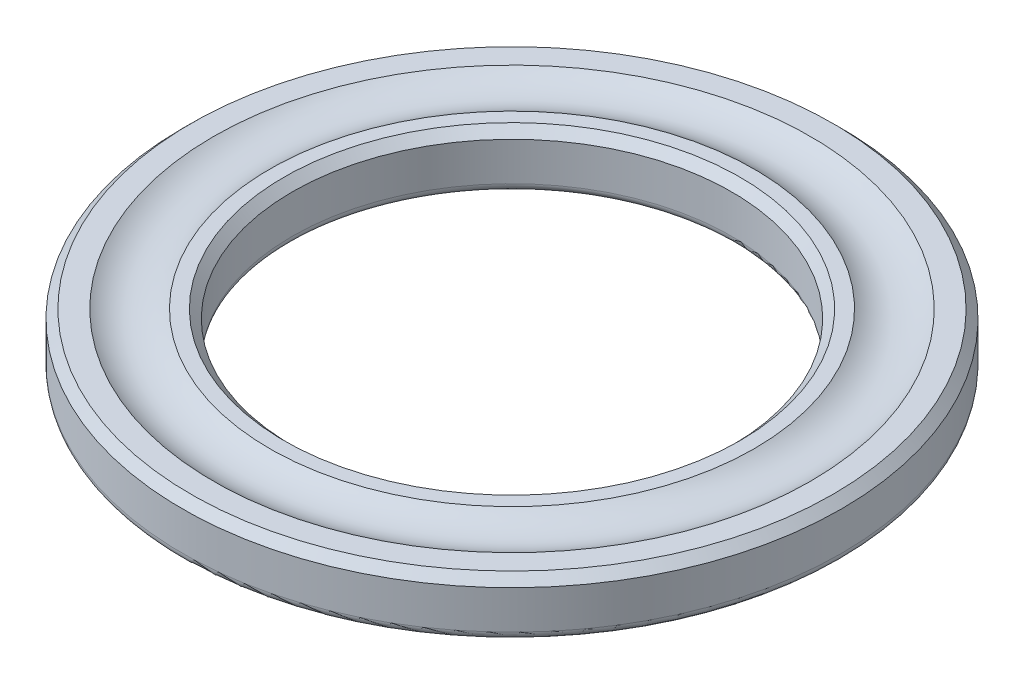
ISO-10303-21;
HEADER;
FILE_DESCRIPTION(('STEP AP214'),'2;1');
FILE_NAME('part.step','',(''),(''),'','','');
FILE_SCHEMA(('AUTOMOTIVE_DESIGN { 1 0 10303 214 1 1 1 1 }'));
ENDSEC;
DATA;
#1=APPLICATION_CONTEXT('core data for automotive mechanical design processes');
#2=APPLICATION_PROTOCOL_DEFINITION('international standard','automotive_design',2000,#1);
#3=PRODUCT_CONTEXT('',#1,'mechanical');
#4=PRODUCT('Part','Part','',(#3));
#5=PRODUCT_RELATED_PRODUCT_CATEGORY('part','',(#4));
#6=PRODUCT_DEFINITION_FORMATION('','',#4);
#7=PRODUCT_DEFINITION_CONTEXT('part definition',#1,'design');
#8=PRODUCT_DEFINITION('design','',#6,#7);
#9=PRODUCT_DEFINITION_SHAPE('','',#8);
#10=(LENGTH_UNIT() NAMED_UNIT(*) SI_UNIT(.MILLI.,.METRE.));
#11=(NAMED_UNIT(*) PLANE_ANGLE_UNIT() SI_UNIT($,.RADIAN.));
#12=(NAMED_UNIT(*) SI_UNIT($,.STERADIAN.) SOLID_ANGLE_UNIT());
#13=UNCERTAINTY_MEASURE_WITH_UNIT(LENGTH_MEASURE(1.E-05),#10,'distance_accuracy_value','');
#14=(GEOMETRIC_REPRESENTATION_CONTEXT(3) GLOBAL_UNCERTAINTY_ASSIGNED_CONTEXT((#13)) GLOBAL_UNIT_ASSIGNED_CONTEXT((#10,
#11,#12)) REPRESENTATION_CONTEXT('',''));
#15=CARTESIAN_POINT('',(0.,0.,0.));
#16=DIRECTION('',(0.,0.,1.));
#17=DIRECTION('',(1.,0.,0.));
#18=AXIS2_PLACEMENT_3D('',#15,#16,#17);
#19=CARTESIAN_POINT('',(32.5,0.,0.));
#20=DIRECTION('',(0.,-1.,0.));
#21=DIRECTION('',(-1.,0.,0.));
#22=AXIS2_PLACEMENT_3D('',#19,#20,#21);
#23=PLANE('',#22);
#24=CARTESIAN_POINT('',(0.,0.,0.));
#25=DIRECTION('',(0.,1.,0.));
#26=DIRECTION('',(1.,0.,0.));
#27=AXIS2_PLACEMENT_3D('',#24,#25,#26);
#28=CIRCLE('',#27,27.);
#29=CARTESIAN_POINT('',(27.,0.,0.));
#30=VERTEX_POINT('',#29);
#31=EDGE_CURVE('E11',#30,#30,#28,.T.);
#32=ORIENTED_EDGE('',*,*,#31,.T.);
#33=EDGE_LOOP('',(#32));
#34=FACE_BOUND('',#33,.T.);
#35=CARTESIAN_POINT('',(0.,0.,0.));
#36=DIRECTION('',(0.,1.,0.));
#37=DIRECTION('',(1.,0.,0.));
#38=AXIS2_PLACEMENT_3D('',#35,#36,#37);
#39=CIRCLE('',#38,38.);
#40=CARTESIAN_POINT('',(38.,0.,0.));
#41=VERTEX_POINT('',#40);
#42=EDGE_CURVE('E21',#41,#41,#39,.T.);
#43=ORIENTED_EDGE('',*,*,#42,.F.);
#44=EDGE_LOOP('',(#43));
#45=FACE_BOUND('',#44,.T.);
#46=ADVANCED_FACE('F17',(#34,#45),#23,.T.);
#47=CARTESIAN_POINT('',(0.,1.,0.));
#48=DIRECTION('',(0.,1.,0.));
#49=DIRECTION('',(0.,0.,1.));
#50=AXIS2_PLACEMENT_3D('',#47,#48,#49);
#51=TOROIDAL_SURFACE('',#50,27.,1.);
#52=CARTESIAN_POINT('',(0.,1.,0.));
#53=DIRECTION('',(0.,1.,0.));
#54=DIRECTION('',(1.,0.,0.));
#55=AXIS2_PLACEMENT_3D('',#52,#53,#54);
#56=CIRCLE('',#55,26.);
#57=CARTESIAN_POINT('',(26.,1.,0.));
#58=VERTEX_POINT('',#57);
#59=EDGE_CURVE('E27',#58,#58,#56,.T.);
#60=ORIENTED_EDGE('',*,*,#59,.T.);
#61=EDGE_LOOP('',(#60));
#62=FACE_BOUND('',#61,.T.);
#63=ORIENTED_EDGE('',*,*,#31,.F.);
#64=EDGE_LOOP('',(#63));
#65=FACE_BOUND('',#64,.T.);
#66=ADVANCED_FACE('F102',(#62,#65),#51,.T.);
#67=CARTESIAN_POINT('',(0.,3.2776,0.));
#68=DIRECTION('',(0.,-1.,0.));
#69=DIRECTION('',(1.,0.,0.));
#70=AXIS2_PLACEMENT_3D('',#67,#68,#69);
#71=CYLINDRICAL_SURFACE('',#70,26.);
#72=CARTESIAN_POINT('',(0.,5.5552,0.));
#73=DIRECTION('',(0.,1.,0.));
#74=DIRECTION('',(1.,0.,0.));
#75=AXIS2_PLACEMENT_3D('',#72,#73,#74);
#76=CIRCLE('',#75,26.);
#77=CARTESIAN_POINT('',(26.,5.5552,0.));
#78=VERTEX_POINT('',#77);
#79=EDGE_CURVE('E62',#78,#78,#76,.T.);
#80=ORIENTED_EDGE('',*,*,#79,.T.);
#81=EDGE_LOOP('',(#80));
#82=FACE_BOUND('',#81,.T.);
#83=ORIENTED_EDGE('',*,*,#59,.F.);
#84=EDGE_LOOP('',(#83));
#85=FACE_BOUND('',#84,.T.);
#86=ADVANCED_FACE('F19',(#82,#85),#71,.F.);
#87=CARTESIAN_POINT('',(0.,6.0552,0.));
#88=DIRECTION('',(0.,1.,0.));
#89=DIRECTION('',(1.,0.,0.));
#90=AXIS2_PLACEMENT_3D('',#87,#88,#89);
#91=CONICAL_SURFACE('',#90,26.5,0.78539816339745);
#92=CARTESIAN_POINT('',(0.,6.5552,0.));
#93=DIRECTION('',(0.,1.,0.));
#94=DIRECTION('',(1.,0.,0.));
#95=AXIS2_PLACEMENT_3D('',#92,#93,#94);
#96=CIRCLE('',#95,27.);
#97=CARTESIAN_POINT('',(27.,6.5552,0.));
#98=VERTEX_POINT('',#97);
#99=EDGE_CURVE('E66',#98,#98,#96,.T.);
#100=ORIENTED_EDGE('',*,*,#99,.T.);
#101=EDGE_LOOP('',(#100));
#102=FACE_BOUND('',#101,.T.);
#103=ORIENTED_EDGE('',*,*,#79,.F.);
#104=EDGE_LOOP('',(#103));
#105=FACE_BOUND('',#104,.T.);
#106=ADVANCED_FACE('F67',(#102,#105),#91,.F.);
#107=CARTESIAN_POINT('',(27.8332,6.5552,0.));
#108=DIRECTION('',(0.,1.,0.));
#109=DIRECTION('',(1.,0.,0.));
#110=AXIS2_PLACEMENT_3D('',#107,#108,#109);
#111=PLANE('',#110);
#112=CARTESIAN_POINT('',(0.,6.5552,0.));
#113=DIRECTION('',(0.,1.,0.));
#114=DIRECTION('',(1.,0.,0.));
#115=AXIS2_PLACEMENT_3D('',#112,#113,#114);
#116=CIRCLE('',#115,28.6664);
#117=CARTESIAN_POINT('',(28.6664,6.5552,0.));
#118=VERTEX_POINT('',#117);
#119=EDGE_CURVE('E70',#118,#118,#116,.T.);
#120=ORIENTED_EDGE('',*,*,#119,.T.);
#121=EDGE_LOOP('',(#120));
#122=FACE_BOUND('',#121,.T.);
#123=ORIENTED_EDGE('',*,*,#99,.F.);
#124=EDGE_LOOP('',(#123));
#125=FACE_BOUND('',#124,.T.);
#126=ADVANCED_FACE('F111',(#122,#125),#111,.T.);
#127=CARTESIAN_POINT('',(0.,11.,0.));
#128=DIRECTION('',(0.,1.,0.));
#129=DIRECTION('',(0.,0.,1.));
#130=AXIS2_PLACEMENT_3D('',#127,#128,#129);
#131=TOROIDAL_SURFACE('',#130,32.,5.556);
#132=CARTESIAN_POINT('',(0.,6.5552,0.));
#133=DIRECTION('',(0.,1.,0.));
#134=DIRECTION('',(1.,0.,0.));
#135=AXIS2_PLACEMENT_3D('',#132,#133,#134);
#136=CIRCLE('',#135,35.3336);
#137=CARTESIAN_POINT('',(35.3336,6.5552,0.));
#138=VERTEX_POINT('',#137);
#139=EDGE_CURVE('E73',#138,#138,#136,.T.);
#140=ORIENTED_EDGE('',*,*,#139,.T.);
#141=EDGE_LOOP('',(#140));
#142=FACE_BOUND('',#141,.T.);
#143=ORIENTED_EDGE('',*,*,#119,.F.);
#144=EDGE_LOOP('',(#143));
#145=FACE_BOUND('',#144,.T.);
#146=ADVANCED_FACE('F98',(#142,#145),#131,.F.);
#147=CARTESIAN_POINT('',(36.6668,6.5552,0.));
#148=DIRECTION('',(0.,1.,0.));
#149=DIRECTION('',(1.,0.,0.));
#150=AXIS2_PLACEMENT_3D('',#147,#148,#149);
#151=PLANE('',#150);
#152=CARTESIAN_POINT('',(0.,6.5552,0.));
#153=DIRECTION('',(0.,1.,0.));
#154=DIRECTION('',(1.,0.,0.));
#155=AXIS2_PLACEMENT_3D('',#152,#153,#154);
#156=CIRCLE('',#155,38.);
#157=CARTESIAN_POINT('',(38.,6.5552,0.));
#158=VERTEX_POINT('',#157);
#159=EDGE_CURVE('E78',#158,#158,#156,.T.);
#160=ORIENTED_EDGE('',*,*,#159,.T.);
#161=EDGE_LOOP('',(#160));
#162=FACE_BOUND('',#161,.T.);
#163=ORIENTED_EDGE('',*,*,#139,.F.);
#164=EDGE_LOOP('',(#163));
#165=FACE_BOUND('',#164,.T.);
#166=ADVANCED_FACE('F83',(#162,#165),#151,.T.);
#167=CARTESIAN_POINT('',(0.,6.0552,0.));
#168=DIRECTION('',(0.,-1.,0.));
#169=DIRECTION('',(1.,0.,0.));
#170=AXIS2_PLACEMENT_3D('',#167,#168,#169);
#171=CONICAL_SURFACE('',#170,38.5,0.785398163397448);
#172=CARTESIAN_POINT('',(0.,5.5552,0.));
#173=DIRECTION('',(0.,1.,0.));
#174=DIRECTION('',(1.,0.,0.));
#175=AXIS2_PLACEMENT_3D('',#172,#173,#174);
#176=CIRCLE('',#175,39.);
#177=CARTESIAN_POINT('',(39.,5.5552,0.));
#178=VERTEX_POINT('',#177);
#179=EDGE_CURVE('E76',#178,#178,#176,.T.);
#180=ORIENTED_EDGE('',*,*,#179,.T.);
#181=EDGE_LOOP('',(#180));
#182=FACE_BOUND('',#181,.T.);
#183=ORIENTED_EDGE('',*,*,#159,.F.);
#184=EDGE_LOOP('',(#183));
#185=FACE_BOUND('',#184,.T.);
#186=ADVANCED_FACE('F86',(#182,#185),#171,.T.);
#187=CARTESIAN_POINT('',(0.,3.2776,0.));
#188=DIRECTION('',(0.,-1.,0.));
#189=DIRECTION('',(1.,0.,0.));
#190=AXIS2_PLACEMENT_3D('',#187,#188,#189);
#191=CYLINDRICAL_SURFACE('',#190,39.);
#192=CARTESIAN_POINT('',(0.,1.,0.));
#193=DIRECTION('',(0.,1.,0.));
#194=DIRECTION('',(1.,0.,0.));
#195=AXIS2_PLACEMENT_3D('',#192,#193,#194);
#196=CIRCLE('',#195,39.);
#197=CARTESIAN_POINT('',(39.,1.,0.));
#198=VERTEX_POINT('',#197);
#199=EDGE_CURVE('E57',#198,#198,#196,.T.);
#200=ORIENTED_EDGE('',*,*,#199,.T.);
#201=EDGE_LOOP('',(#200));
#202=FACE_BOUND('',#201,.T.);
#203=ORIENTED_EDGE('',*,*,#179,.F.);
#204=EDGE_LOOP('',(#203));
#205=FACE_BOUND('',#204,.T.);
#206=ADVANCED_FACE('F88',(#202,#205),#191,.T.);
#207=CARTESIAN_POINT('',(0.,1.,0.));
#208=DIRECTION('',(0.,1.,0.));
#209=DIRECTION('',(0.,0.,1.));
#210=AXIS2_PLACEMENT_3D('',#207,#208,#209);
#211=TOROIDAL_SURFACE('',#210,38.,1.);
#212=ORIENTED_EDGE('',*,*,#42,.T.);
#213=EDGE_LOOP('',(#212));
#214=FACE_BOUND('',#213,.T.);
#215=ORIENTED_EDGE('',*,*,#199,.F.);
#216=EDGE_LOOP('',(#215));
#217=FACE_BOUND('',#216,.T.);
#218=ADVANCED_FACE('F96',(#214,#217),#211,.T.);
#219=CLOSED_SHELL('',(#46,#66,#86,#106,#126,#146,#166,#186,#206,#218));
#220=MANIFOLD_SOLID_BREP('B1',#219);
#221=ADVANCED_BREP_SHAPE_REPRESENTATION('',(#18,#220),#14);
#222=SHAPE_DEFINITION_REPRESENTATION(#9,#221);
ENDSEC;
END-ISO-10303-21;
